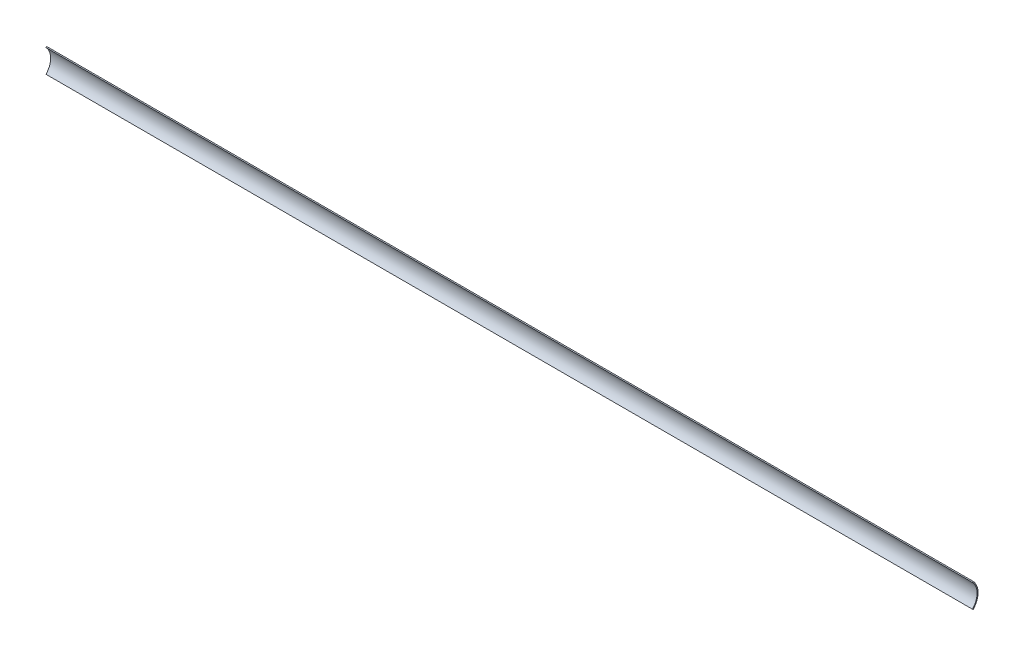
ISO-10303-21;
HEADER;
FILE_DESCRIPTION(('STEP AP214'),'2;1');
FILE_NAME('part.step','',(''),(''),'','','');
FILE_SCHEMA(('AUTOMOTIVE_DESIGN { 1 0 10303 214 1 1 1 1 }'));
ENDSEC;
DATA;
#1=APPLICATION_CONTEXT('core data for automotive mechanical design processes');
#2=APPLICATION_PROTOCOL_DEFINITION('international standard','automotive_design',2000,#1);
#3=PRODUCT_CONTEXT('',#1,'mechanical');
#4=PRODUCT('Part','Part','',(#3));
#5=PRODUCT_RELATED_PRODUCT_CATEGORY('part','',(#4));
#6=PRODUCT_DEFINITION_FORMATION('','',#4);
#7=PRODUCT_DEFINITION_CONTEXT('part definition',#1,'design');
#8=PRODUCT_DEFINITION('design','',#6,#7);
#9=PRODUCT_DEFINITION_SHAPE('','',#8);
#10=(LENGTH_UNIT() NAMED_UNIT(*) SI_UNIT(.MILLI.,.METRE.));
#11=(NAMED_UNIT(*) PLANE_ANGLE_UNIT() SI_UNIT($,.RADIAN.));
#12=(NAMED_UNIT(*) SI_UNIT($,.STERADIAN.) SOLID_ANGLE_UNIT());
#13=UNCERTAINTY_MEASURE_WITH_UNIT(LENGTH_MEASURE(1.E-05),#10,'distance_accuracy_value','');
#14=(GEOMETRIC_REPRESENTATION_CONTEXT(3) GLOBAL_UNCERTAINTY_ASSIGNED_CONTEXT((#13)) GLOBAL_UNIT_ASSIGNED_CONTEXT((#10,
#11,#12)) REPRESENTATION_CONTEXT('',''));
#15=CARTESIAN_POINT('',(0.,0.,0.));
#16=DIRECTION('',(0.,0.,1.));
#17=DIRECTION('',(1.,0.,0.));
#18=AXIS2_PLACEMENT_3D('',#15,#16,#17);
#19=CARTESIAN_POINT('',(200.,2.5,3.625));
#20=DIRECTION('',(-1.,0.,0.));
#21=DIRECTION('',(0.,0.,1.));
#22=AXIS2_PLACEMENT_3D('',#19,#20,#21);
#23=CYLINDRICAL_SURFACE('',#22,3.825);
#24=CARTESIAN_POINT('',(0.,2.5,3.625));
#25=DIRECTION('',(1.,0.,0.));
#26=DIRECTION('',(0.,1.,0.));
#27=AXIS2_PLACEMENT_3D('',#24,#25,#26);
#28=CIRCLE('',#27,3.825);
#29=CARTESIAN_POINT('',(0.,-0.13793103448276,0.855172413793104));
#30=VERTEX_POINT('',#29);
#31=CARTESIAN_POINT('',(0.,5.13793103448276,0.855172413793102));
#32=VERTEX_POINT('',#31);
#33=EDGE_CURVE('E102',#30,#32,#28,.T.);
#34=ORIENTED_EDGE('',*,*,#33,.T.);
#35=DIRECTION('',(-1.,0.,0.));
#36=VECTOR('',#35,1.);
#37=CARTESIAN_POINT('',(200.,5.13793103448276,0.855172413793102));
#38=LINE('',#37,#36);
#39=CARTESIAN_POINT('',(200.,5.13793103448276,0.855172413793102));
#40=VERTEX_POINT('',#39);
#41=EDGE_CURVE('E11',#40,#32,#38,.T.);
#42=ORIENTED_EDGE('',*,*,#41,.F.);
#43=CARTESIAN_POINT('',(200.,2.5,3.625));
#44=DIRECTION('',(1.,0.,0.));
#45=DIRECTION('',(0.,1.,0.));
#46=AXIS2_PLACEMENT_3D('',#43,#44,#45);
#47=CIRCLE('',#46,3.825);
#48=CARTESIAN_POINT('',(200.,-0.13793103448276,0.855172413793104));
#49=VERTEX_POINT('',#48);
#50=EDGE_CURVE('E79',#49,#40,#47,.T.);
#51=ORIENTED_EDGE('',*,*,#50,.F.);
#52=DIRECTION('',(-1.,0.,0.));
#53=VECTOR('',#52,1.);
#54=CARTESIAN_POINT('',(200.,-0.13793103448276,0.855172413793104));
#55=LINE('',#54,#53);
#56=EDGE_CURVE('E55',#49,#30,#55,.T.);
#57=ORIENTED_EDGE('',*,*,#56,.T.);
#58=EDGE_LOOP('',(#34,#42,#51,#57));
#59=FACE_BOUND('',#58,.T.);
#60=ADVANCED_FACE('F39',(#59),#23,.T.);
#61=CARTESIAN_POINT('',(200.,5.,0.999999999999999));
#62=DIRECTION('',(0.,0.724137931034486,0.68965517241379));
#63=DIRECTION('',(0.,-0.68965517241379,0.724137931034486));
#64=AXIS2_PLACEMENT_3D('',#61,#62,#63);
#65=PLANE('',#64);
#66=DIRECTION('',(0.,0.68965517241379,-0.724137931034486));
#67=VECTOR('',#66,1.);
#68=CARTESIAN_POINT('',(0.,5.,0.999999999999999));
#69=LINE('',#68,#67);
#70=CARTESIAN_POINT('',(0.,5.,0.999999999999999));
#71=VERTEX_POINT('',#70);
#72=EDGE_CURVE('E88',#71,#32,#69,.T.);
#73=ORIENTED_EDGE('',*,*,#72,.F.);
#74=DIRECTION('',(-1.,0.,0.));
#75=VECTOR('',#74,1.);
#76=CARTESIAN_POINT('',(200.,5.,0.999999999999999));
#77=LINE('',#76,#75);
#78=CARTESIAN_POINT('',(200.,5.,0.999999999999999));
#79=VERTEX_POINT('',#78);
#80=EDGE_CURVE('E47',#79,#71,#77,.T.);
#81=ORIENTED_EDGE('',*,*,#80,.F.);
#82=DIRECTION('',(0.,0.68965517241379,-0.724137931034486));
#83=VECTOR('',#82,1.);
#84=CARTESIAN_POINT('',(200.,5.,0.999999999999999));
#85=LINE('',#84,#83);
#86=EDGE_CURVE('E86',#79,#40,#85,.T.);
#87=ORIENTED_EDGE('',*,*,#86,.T.);
#88=ORIENTED_EDGE('',*,*,#41,.T.);
#89=EDGE_LOOP('',(#73,#81,#87,#88));
#90=FACE_BOUND('',#89,.T.);
#91=ADVANCED_FACE('F85',(#90),#65,.T.);
#92=CARTESIAN_POINT('',(200.,2.5,3.625));
#93=DIRECTION('',(-1.,0.,0.));
#94=DIRECTION('',(0.,0.,1.));
#95=AXIS2_PLACEMENT_3D('',#92,#93,#94);
#96=CYLINDRICAL_SURFACE('',#95,3.625);
#97=CARTESIAN_POINT('',(0.,2.5,3.625));
#98=DIRECTION('',(1.,0.,0.));
#99=DIRECTION('',(0.,0.,-1.));
#100=AXIS2_PLACEMENT_3D('',#97,#98,#99);
#101=CIRCLE('',#100,3.625);
#102=CARTESIAN_POINT('',(0.,0.,1.));
#103=VERTEX_POINT('',#102);
#104=EDGE_CURVE('E105',#103,#71,#101,.T.);
#105=ORIENTED_EDGE('',*,*,#104,.F.);
#106=DIRECTION('',(-1.,0.,0.));
#107=VECTOR('',#106,1.);
#108=CARTESIAN_POINT('',(200.,0.,1.));
#109=LINE('',#108,#107);
#110=CARTESIAN_POINT('',(200.,0.,1.));
#111=VERTEX_POINT('',#110);
#112=EDGE_CURVE('E68',#111,#103,#109,.T.);
#113=ORIENTED_EDGE('',*,*,#112,.F.);
#114=CARTESIAN_POINT('',(200.,2.5,3.625));
#115=DIRECTION('',(1.,0.,0.));
#116=DIRECTION('',(0.,0.,-1.));
#117=AXIS2_PLACEMENT_3D('',#114,#115,#116);
#118=CIRCLE('',#117,3.625);
#119=EDGE_CURVE('E94',#111,#79,#118,.T.);
#120=ORIENTED_EDGE('',*,*,#119,.T.);
#121=ORIENTED_EDGE('',*,*,#80,.T.);
#122=EDGE_LOOP('',(#105,#113,#120,#121));
#123=FACE_BOUND('',#122,.T.);
#124=ADVANCED_FACE('F96',(#123),#96,.F.);
#125=CARTESIAN_POINT('',(200.,-0.13793103448276,0.855172413793104));
#126=DIRECTION('',(0.,-0.724137931034477,0.689655172413799));
#127=DIRECTION('',(0.,-0.689655172413799,-0.724137931034477));
#128=AXIS2_PLACEMENT_3D('',#125,#126,#127);
#129=PLANE('',#128);
#130=DIRECTION('',(0.,0.689655172413799,0.724137931034477));
#131=VECTOR('',#130,1.);
#132=CARTESIAN_POINT('',(0.,-0.13793103448276,0.855172413793104));
#133=LINE('',#132,#131);
#134=EDGE_CURVE('E107',#30,#103,#133,.T.);
#135=ORIENTED_EDGE('',*,*,#134,.F.);
#136=ORIENTED_EDGE('',*,*,#56,.F.);
#137=DIRECTION('',(0.,0.689655172413799,0.724137931034477));
#138=VECTOR('',#137,1.);
#139=CARTESIAN_POINT('',(200.,-0.13793103448276,0.855172413793104));
#140=LINE('',#139,#138);
#141=EDGE_CURVE('E97',#49,#111,#140,.T.);
#142=ORIENTED_EDGE('',*,*,#141,.T.);
#143=ORIENTED_EDGE('',*,*,#112,.T.);
#144=EDGE_LOOP('',(#135,#136,#142,#143));
#145=FACE_BOUND('',#144,.T.);
#146=ADVANCED_FACE('F113',(#145),#129,.T.);
#147=CARTESIAN_POINT('',(200.,2.5,3.625));
#148=DIRECTION('',(1.,0.,0.));
#149=DIRECTION('',(0.,1.,0.));
#150=AXIS2_PLACEMENT_3D('',#147,#148,#149);
#151=PLANE('',#150);
#152=ORIENTED_EDGE('',*,*,#50,.T.);
#153=ORIENTED_EDGE('',*,*,#86,.F.);
#154=ORIENTED_EDGE('',*,*,#119,.F.);
#155=ORIENTED_EDGE('',*,*,#141,.F.);
#156=EDGE_LOOP('',(#152,#153,#154,#155));
#157=FACE_BOUND('',#156,.T.);
#158=ADVANCED_FACE('F93',(#157),#151,.T.);
#159=CARTESIAN_POINT('',(0.,2.5,3.625));
#160=DIRECTION('',(1.,0.,0.));
#161=DIRECTION('',(0.,1.,0.));
#162=AXIS2_PLACEMENT_3D('',#159,#160,#161);
#163=PLANE('',#162);
#164=ORIENTED_EDGE('',*,*,#33,.F.);
#165=ORIENTED_EDGE('',*,*,#134,.T.);
#166=ORIENTED_EDGE('',*,*,#104,.T.);
#167=ORIENTED_EDGE('',*,*,#72,.T.);
#168=EDGE_LOOP('',(#164,#165,#166,#167));
#169=FACE_BOUND('',#168,.T.);
#170=ADVANCED_FACE('F112',(#169),#163,.F.);
#171=CLOSED_SHELL('',(#60,#91,#124,#146,#158,#170));
#172=MANIFOLD_SOLID_BREP('B2',#171);
#173=ADVANCED_BREP_SHAPE_REPRESENTATION('',(#18,#172),#14);
#174=SHAPE_DEFINITION_REPRESENTATION(#9,#173);
ENDSEC;
END-ISO-10303-21;
